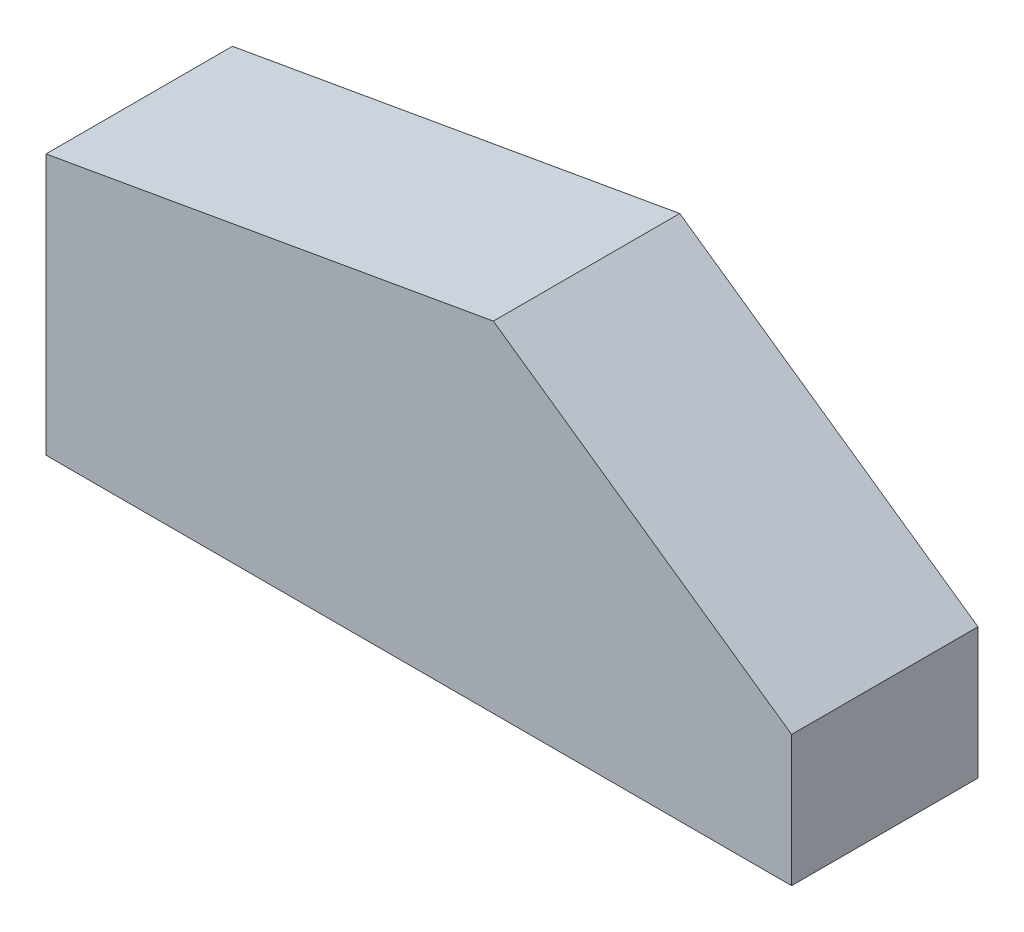
ISO-10303-21;
HEADER;
FILE_DESCRIPTION(('STEP AP214'),'2;1');
FILE_NAME('part.step','',(''),(''),'','','');
FILE_SCHEMA(('AUTOMOTIVE_DESIGN { 1 0 10303 214 1 1 1 1 }'));
ENDSEC;
DATA;
#1=APPLICATION_CONTEXT('core data for automotive mechanical design processes');
#2=APPLICATION_PROTOCOL_DEFINITION('international standard','automotive_design',2000,#1);
#3=PRODUCT_CONTEXT('',#1,'mechanical');
#4=PRODUCT('Part','Part','',(#3));
#5=PRODUCT_RELATED_PRODUCT_CATEGORY('part','',(#4));
#6=PRODUCT_DEFINITION_FORMATION('','',#4);
#7=PRODUCT_DEFINITION_CONTEXT('part definition',#1,'design');
#8=PRODUCT_DEFINITION('design','',#6,#7);
#9=PRODUCT_DEFINITION_SHAPE('','',#8);
#10=(LENGTH_UNIT() NAMED_UNIT(*) SI_UNIT(.MILLI.,.METRE.));
#11=(NAMED_UNIT(*) PLANE_ANGLE_UNIT() SI_UNIT($,.RADIAN.));
#12=(NAMED_UNIT(*) SI_UNIT($,.STERADIAN.) SOLID_ANGLE_UNIT());
#13=UNCERTAINTY_MEASURE_WITH_UNIT(LENGTH_MEASURE(1.E-05),#10,'distance_accuracy_value','');
#14=(GEOMETRIC_REPRESENTATION_CONTEXT(3) GLOBAL_UNCERTAINTY_ASSIGNED_CONTEXT((#13)) GLOBAL_UNIT_ASSIGNED_CONTEXT((#10,
#11,#12)) REPRESENTATION_CONTEXT('',''));
#15=CARTESIAN_POINT('',(0.,0.,0.));
#16=DIRECTION('',(0.,0.,1.));
#17=DIRECTION('',(1.,0.,0.));
#18=AXIS2_PLACEMENT_3D('',#15,#16,#17);
#19=CARTESIAN_POINT('',(100.,0.,25.));
#20=DIRECTION('',(0.,1.,0.));
#21=DIRECTION('',(0.,0.,1.));
#22=AXIS2_PLACEMENT_3D('',#19,#20,#21);
#23=PLANE('',#22);
#24=DIRECTION('',(1.,0.,0.));
#25=VECTOR('',#24,1.);
#26=CARTESIAN_POINT('',(100.,0.,0.));
#27=LINE('',#26,#25);
#28=CARTESIAN_POINT('',(0.,0.,0.));
#29=VERTEX_POINT('',#28);
#30=CARTESIAN_POINT('',(100.,0.,0.));
#31=VERTEX_POINT('',#30);
#32=EDGE_CURVE('E118',#29,#31,#27,.T.);
#33=ORIENTED_EDGE('',*,*,#32,.T.);
#34=DIRECTION('',(0.,0.,-1.));
#35=VECTOR('',#34,1.);
#36=CARTESIAN_POINT('',(100.,0.,25.));
#37=LINE('',#36,#35);
#38=CARTESIAN_POINT('',(100.,0.,25.));
#39=VERTEX_POINT('',#38);
#40=EDGE_CURVE('E11',#39,#31,#37,.T.);
#41=ORIENTED_EDGE('',*,*,#40,.F.);
#42=DIRECTION('',(1.,0.,0.));
#43=VECTOR('',#42,1.);
#44=CARTESIAN_POINT('',(100.,0.,25.));
#45=LINE('',#44,#43);
#46=CARTESIAN_POINT('',(0.,0.,25.));
#47=VERTEX_POINT('',#46);
#48=EDGE_CURVE('E131',#47,#39,#45,.T.);
#49=ORIENTED_EDGE('',*,*,#48,.F.);
#50=DIRECTION('',(0.,0.,-1.));
#51=VECTOR('',#50,1.);
#52=CARTESIAN_POINT('',(0.,0.,25.));
#53=LINE('',#52,#51);
#54=EDGE_CURVE('E114',#47,#29,#53,.T.);
#55=ORIENTED_EDGE('',*,*,#54,.T.);
#56=EDGE_LOOP('',(#33,#41,#49,#55));
#57=FACE_BOUND('',#56,.T.);
#58=ADVANCED_FACE('F39',(#57),#23,.F.);
#59=CARTESIAN_POINT('',(100.,17.571317314119,25.));
#60=DIRECTION('',(-1.,0.,0.));
#61=DIRECTION('',(0.,0.,1.));
#62=AXIS2_PLACEMENT_3D('',#59,#60,#61);
#63=PLANE('',#62);
#64=DIRECTION('',(0.,1.,0.));
#65=VECTOR('',#64,1.);
#66=CARTESIAN_POINT('',(100.,17.571317314119,0.));
#67=LINE('',#66,#65);
#68=CARTESIAN_POINT('',(100.,17.571317314119,0.));
#69=VERTEX_POINT('',#68);
#70=EDGE_CURVE('E122',#31,#69,#67,.T.);
#71=ORIENTED_EDGE('',*,*,#70,.T.);
#72=DIRECTION('',(0.,0.,-1.));
#73=VECTOR('',#72,1.);
#74=CARTESIAN_POINT('',(100.,17.571317314119,25.));
#75=LINE('',#74,#73);
#76=CARTESIAN_POINT('',(100.,17.571317314119,25.));
#77=VERTEX_POINT('',#76);
#78=EDGE_CURVE('E48',#77,#69,#75,.T.);
#79=ORIENTED_EDGE('',*,*,#78,.F.);
#80=DIRECTION('',(0.,1.,0.));
#81=VECTOR('',#80,1.);
#82=CARTESIAN_POINT('',(100.,17.571317314119,25.));
#83=LINE('',#82,#81);
#84=EDGE_CURVE('E90',#39,#77,#83,.T.);
#85=ORIENTED_EDGE('',*,*,#84,.F.);
#86=ORIENTED_EDGE('',*,*,#40,.T.);
#87=EDGE_LOOP('',(#71,#79,#85,#86));
#88=FACE_BOUND('',#87,.T.);
#89=ADVANCED_FACE('F153',(#88),#63,.F.);
#90=CARTESIAN_POINT('',(60.,45.5796188425077,25.));
#91=DIRECTION('',(-0.57357643635105,-0.819152044288989,0.));
#92=DIRECTION('',(0.819152044288989,-0.57357643635105,0.));
#93=AXIS2_PLACEMENT_3D('',#90,#91,#92);
#94=PLANE('',#93);
#95=DIRECTION('',(-0.819152044288989,0.57357643635105,0.));
#96=VECTOR('',#95,1.);
#97=CARTESIAN_POINT('',(60.,45.5796188425077,0.));
#98=LINE('',#97,#96);
#99=CARTESIAN_POINT('',(60.,45.5796188425077,0.));
#100=VERTEX_POINT('',#99);
#101=EDGE_CURVE('E106',#69,#100,#98,.T.);
#102=ORIENTED_EDGE('',*,*,#101,.T.);
#103=DIRECTION('',(0.,0.,-1.));
#104=VECTOR('',#103,1.);
#105=CARTESIAN_POINT('',(60.,45.5796188425077,25.));
#106=LINE('',#105,#104);
#107=CARTESIAN_POINT('',(60.,45.5796188425077,25.));
#108=VERTEX_POINT('',#107);
#109=EDGE_CURVE('E103',#108,#100,#106,.T.);
#110=ORIENTED_EDGE('',*,*,#109,.F.);
#111=DIRECTION('',(-0.819152044288989,0.57357643635105,0.));
#112=VECTOR('',#111,1.);
#113=CARTESIAN_POINT('',(60.,45.5796188425077,25.));
#114=LINE('',#113,#112);
#115=EDGE_CURVE('E94',#77,#108,#114,.T.);
#116=ORIENTED_EDGE('',*,*,#115,.F.);
#117=ORIENTED_EDGE('',*,*,#78,.T.);
#118=EDGE_LOOP('',(#102,#110,#116,#117));
#119=FACE_BOUND('',#118,.T.);
#120=ADVANCED_FACE('F104',(#119),#94,.F.);
#121=CARTESIAN_POINT('',(0.,35.,25.));
#122=DIRECTION('',(0.173648177666927,-0.984807753012209,0.));
#123=DIRECTION('',(0.984807753012209,0.173648177666927,0.));
#124=AXIS2_PLACEMENT_3D('',#121,#122,#123);
#125=PLANE('',#124);
#126=DIRECTION('',(-0.984807753012208,-0.173648177666927,0.));
#127=VECTOR('',#126,1.);
#128=CARTESIAN_POINT('',(0.,35.,0.));
#129=LINE('',#128,#127);
#130=CARTESIAN_POINT('',(0.,35.,0.));
#131=VERTEX_POINT('',#130);
#132=EDGE_CURVE('E76',#100,#131,#129,.T.);
#133=ORIENTED_EDGE('',*,*,#132,.T.);
#134=DIRECTION('',(0.,0.,-1.));
#135=VECTOR('',#134,1.);
#136=CARTESIAN_POINT('',(0.,35.,25.));
#137=LINE('',#136,#135);
#138=CARTESIAN_POINT('',(0.,35.,25.));
#139=VERTEX_POINT('',#138);
#140=EDGE_CURVE('E108',#139,#131,#137,.T.);
#141=ORIENTED_EDGE('',*,*,#140,.F.);
#142=DIRECTION('',(-0.984807753012208,-0.173648177666927,0.));
#143=VECTOR('',#142,1.);
#144=CARTESIAN_POINT('',(0.,35.,25.));
#145=LINE('',#144,#143);
#146=EDGE_CURVE('E98',#108,#139,#145,.T.);
#147=ORIENTED_EDGE('',*,*,#146,.F.);
#148=ORIENTED_EDGE('',*,*,#109,.T.);
#149=EDGE_LOOP('',(#133,#141,#147,#148));
#150=FACE_BOUND('',#149,.T.);
#151=ADVANCED_FACE('F110',(#150),#125,.F.);
#152=CARTESIAN_POINT('',(0.,0.,25.));
#153=DIRECTION('',(1.,0.,0.));
#154=DIRECTION('',(0.,0.,-1.));
#155=AXIS2_PLACEMENT_3D('',#152,#153,#154);
#156=PLANE('',#155);
#157=DIRECTION('',(0.,-1.,0.));
#158=VECTOR('',#157,1.);
#159=CARTESIAN_POINT('',(0.,0.,0.));
#160=LINE('',#159,#158);
#161=EDGE_CURVE('E82',#131,#29,#160,.T.);
#162=ORIENTED_EDGE('',*,*,#161,.T.);
#163=ORIENTED_EDGE('',*,*,#54,.F.);
#164=DIRECTION('',(0.,-1.,0.));
#165=VECTOR('',#164,1.);
#166=CARTESIAN_POINT('',(0.,0.,25.));
#167=LINE('',#166,#165);
#168=EDGE_CURVE('E56',#139,#47,#167,.T.);
#169=ORIENTED_EDGE('',*,*,#168,.F.);
#170=ORIENTED_EDGE('',*,*,#140,.T.);
#171=EDGE_LOOP('',(#162,#163,#169,#170));
#172=FACE_BOUND('',#171,.T.);
#173=ADVANCED_FACE('F142',(#172),#156,.F.);
#174=CARTESIAN_POINT('',(0.,0.,25.));
#175=DIRECTION('',(0.,0.,-1.));
#176=DIRECTION('',(-1.,0.,0.));
#177=AXIS2_PLACEMENT_3D('',#174,#175,#176);
#178=PLANE('',#177);
#179=ORIENTED_EDGE('',*,*,#48,.T.);
#180=ORIENTED_EDGE('',*,*,#84,.T.);
#181=ORIENTED_EDGE('',*,*,#115,.T.);
#182=ORIENTED_EDGE('',*,*,#146,.T.);
#183=ORIENTED_EDGE('',*,*,#168,.T.);
#184=EDGE_LOOP('',(#179,#180,#181,#182,#183));
#185=FACE_BOUND('',#184,.T.);
#186=ADVANCED_FACE('F96',(#185),#178,.F.);
#187=CARTESIAN_POINT('',(0.,0.,0.));
#188=DIRECTION('',(0.,0.,-1.));
#189=DIRECTION('',(-1.,0.,0.));
#190=AXIS2_PLACEMENT_3D('',#187,#188,#189);
#191=PLANE('',#190);
#192=ORIENTED_EDGE('',*,*,#32,.F.);
#193=ORIENTED_EDGE('',*,*,#161,.F.);
#194=ORIENTED_EDGE('',*,*,#132,.F.);
#195=ORIENTED_EDGE('',*,*,#101,.F.);
#196=ORIENTED_EDGE('',*,*,#70,.F.);
#197=EDGE_LOOP('',(#192,#193,#194,#195,#196));
#198=FACE_BOUND('',#197,.T.);
#199=ADVANCED_FACE('F138',(#198),#191,.T.);
#200=CLOSED_SHELL('',(#58,#89,#120,#151,#173,#186,#199));
#201=MANIFOLD_SOLID_BREP('B2',#200);
#202=ADVANCED_BREP_SHAPE_REPRESENTATION('',(#18,#201),#14);
#203=SHAPE_DEFINITION_REPRESENTATION(#9,#202);
ENDSEC;
END-ISO-10303-21;
